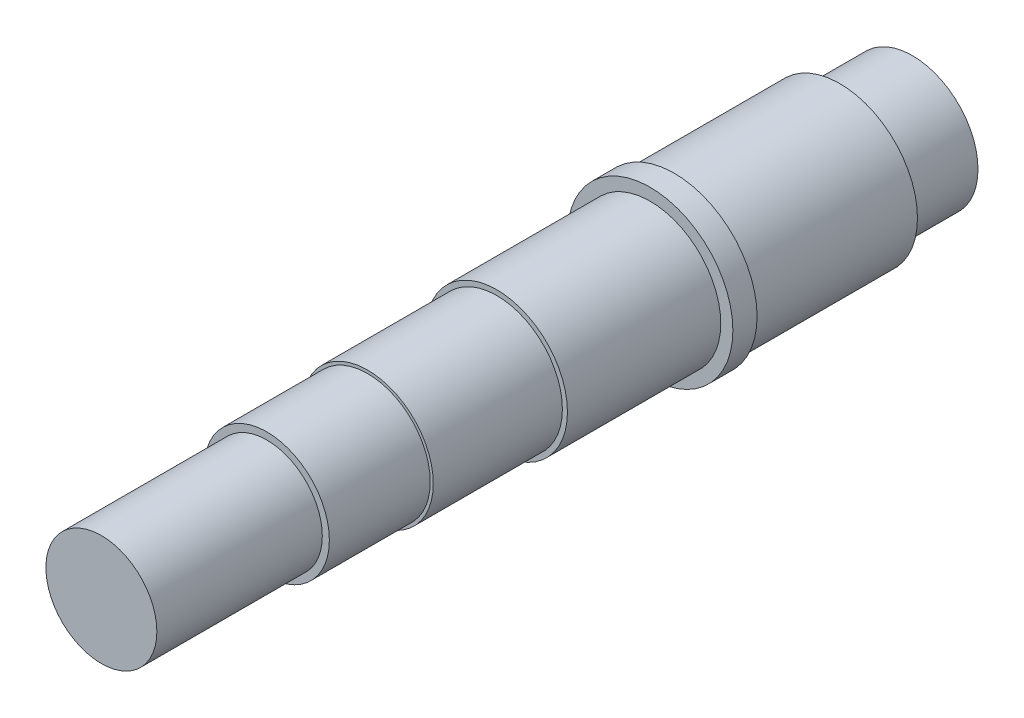
ISO-10303-21;
HEADER;
FILE_DESCRIPTION(('STEP AP214'),'2;1');
FILE_NAME('part.step','',(''),(''),'','','');
FILE_SCHEMA(('AUTOMOTIVE_DESIGN { 1 0 10303 214 1 1 1 1 }'));
ENDSEC;
DATA;
#1=APPLICATION_CONTEXT('core data for automotive mechanical design processes');
#2=APPLICATION_PROTOCOL_DEFINITION('international standard','automotive_design',2000,#1);
#3=PRODUCT_CONTEXT('',#1,'mechanical');
#4=PRODUCT('Part','Part','',(#3));
#5=PRODUCT_RELATED_PRODUCT_CATEGORY('part','',(#4));
#6=PRODUCT_DEFINITION_FORMATION('','',#4);
#7=PRODUCT_DEFINITION_CONTEXT('part definition',#1,'design');
#8=PRODUCT_DEFINITION('design','',#6,#7);
#9=PRODUCT_DEFINITION_SHAPE('','',#8);
#10=(LENGTH_UNIT() NAMED_UNIT(*) SI_UNIT(.MILLI.,.METRE.));
#11=(NAMED_UNIT(*) PLANE_ANGLE_UNIT() SI_UNIT($,.RADIAN.));
#12=(NAMED_UNIT(*) SI_UNIT($,.STERADIAN.) SOLID_ANGLE_UNIT());
#13=UNCERTAINTY_MEASURE_WITH_UNIT(LENGTH_MEASURE(1.E-05),#10,'distance_accuracy_value','');
#14=(GEOMETRIC_REPRESENTATION_CONTEXT(3) GLOBAL_UNCERTAINTY_ASSIGNED_CONTEXT((#13)) GLOBAL_UNIT_ASSIGNED_CONTEXT((#10,
#11,#12)) REPRESENTATION_CONTEXT('',''));
#15=CARTESIAN_POINT('',(0.,0.,0.));
#16=DIRECTION('',(0.,0.,1.));
#17=DIRECTION('',(1.,0.,0.));
#18=AXIS2_PLACEMENT_3D('',#15,#16,#17);
#19=CARTESIAN_POINT('',(0.,0.,320.));
#20=DIRECTION('',(0.,0.,1.));
#21=DIRECTION('',(1.,0.,0.));
#22=AXIS2_PLACEMENT_3D('',#19,#20,#21);
#23=PLANE('',#22);
#24=CARTESIAN_POINT('',(0.,0.,320.));
#25=DIRECTION('',(0.,0.,1.));
#26=DIRECTION('',(1.,0.,0.));
#27=AXIS2_PLACEMENT_3D('',#24,#25,#26);
#28=CIRCLE('',#27,31.);
#29=CARTESIAN_POINT('',(31.,0.,320.));
#30=VERTEX_POINT('',#29);
#31=EDGE_CURVE('E67',#30,#30,#28,.T.);
#32=ORIENTED_EDGE('',*,*,#31,.T.);
#33=EDGE_LOOP('',(#32));
#34=FACE_BOUND('',#33,.T.);
#35=CARTESIAN_POINT('',(0.,0.,320.));
#36=DIRECTION('',(0.,0.,1.));
#37=DIRECTION('',(1.,0.,0.));
#38=AXIS2_PLACEMENT_3D('',#35,#36,#37);
#39=CIRCLE('',#38,27.5);
#40=CARTESIAN_POINT('',(27.5,0.,320.));
#41=VERTEX_POINT('',#40);
#42=EDGE_CURVE('E76',#41,#41,#39,.T.);
#43=ORIENTED_EDGE('',*,*,#42,.F.);
#44=EDGE_LOOP('',(#43));
#45=FACE_BOUND('',#44,.T.);
#46=ADVANCED_FACE('F33',(#34,#45),#23,.T.);
#47=CARTESIAN_POINT('',(0.,0.,270.));
#48=DIRECTION('',(0.,0.,1.));
#49=DIRECTION('',(1.,0.,0.));
#50=AXIS2_PLACEMENT_3D('',#47,#48,#49);
#51=PLANE('',#50);
#52=CARTESIAN_POINT('',(0.,0.,270.));
#53=DIRECTION('',(0.,0.,1.));
#54=DIRECTION('',(1.,0.,0.));
#55=AXIS2_PLACEMENT_3D('',#52,#53,#54);
#56=CIRCLE('',#55,32.5);
#57=CARTESIAN_POINT('',(32.5,0.,270.));
#58=VERTEX_POINT('',#57);
#59=EDGE_CURVE('E61',#58,#58,#56,.T.);
#60=ORIENTED_EDGE('',*,*,#59,.T.);
#61=EDGE_LOOP('',(#60));
#62=FACE_BOUND('',#61,.T.);
#63=CARTESIAN_POINT('',(0.,0.,270.));
#64=DIRECTION('',(0.,0.,1.));
#65=DIRECTION('',(1.,0.,0.));
#66=AXIS2_PLACEMENT_3D('',#63,#64,#65);
#67=CIRCLE('',#66,31.);
#68=CARTESIAN_POINT('',(31.,0.,270.));
#69=VERTEX_POINT('',#68);
#70=EDGE_CURVE('E70',#69,#69,#67,.T.);
#71=ORIENTED_EDGE('',*,*,#70,.F.);
#72=EDGE_LOOP('',(#71));
#73=FACE_BOUND('',#72,.T.);
#74=ADVANCED_FACE('F92',(#62,#73),#51,.T.);
#75=CARTESIAN_POINT('',(0.,0.,206.));
#76=DIRECTION('',(0.,0.,1.));
#77=DIRECTION('',(1.,0.,0.));
#78=AXIS2_PLACEMENT_3D('',#75,#76,#77);
#79=PLANE('',#78);
#80=CARTESIAN_POINT('',(0.,0.,206.));
#81=DIRECTION('',(0.,0.,1.));
#82=DIRECTION('',(1.,0.,0.));
#83=AXIS2_PLACEMENT_3D('',#80,#81,#82);
#84=CIRCLE('',#83,35.);
#85=CARTESIAN_POINT('',(35.,0.,206.));
#86=VERTEX_POINT('',#85);
#87=EDGE_CURVE('E55',#86,#86,#84,.T.);
#88=ORIENTED_EDGE('',*,*,#87,.T.);
#89=EDGE_LOOP('',(#88));
#90=FACE_BOUND('',#89,.T.);
#91=CARTESIAN_POINT('',(0.,0.,206.));
#92=DIRECTION('',(0.,0.,1.));
#93=DIRECTION('',(1.,0.,0.));
#94=AXIS2_PLACEMENT_3D('',#91,#92,#93);
#95=CIRCLE('',#94,32.5);
#96=CARTESIAN_POINT('',(32.5,0.,206.));
#97=VERTEX_POINT('',#96);
#98=EDGE_CURVE('E64',#97,#97,#95,.T.);
#99=ORIENTED_EDGE('',*,*,#98,.F.);
#100=EDGE_LOOP('',(#99));
#101=FACE_BOUND('',#100,.T.);
#102=ADVANCED_FACE('F98',(#90,#101),#79,.T.);
#103=CARTESIAN_POINT('',(0.,0.,130.));
#104=DIRECTION('',(0.,0.,1.));
#105=DIRECTION('',(1.,0.,0.));
#106=AXIS2_PLACEMENT_3D('',#103,#104,#105);
#107=PLANE('',#106);
#108=CARTESIAN_POINT('',(0.,0.,130.));
#109=DIRECTION('',(0.,0.,1.));
#110=DIRECTION('',(1.,0.,0.));
#111=AXIS2_PLACEMENT_3D('',#108,#109,#110);
#112=CIRCLE('',#111,41.);
#113=CARTESIAN_POINT('',(41.,0.,130.));
#114=VERTEX_POINT('',#113);
#115=EDGE_CURVE('E49',#114,#114,#112,.T.);
#116=ORIENTED_EDGE('',*,*,#115,.T.);
#117=EDGE_LOOP('',(#116));
#118=FACE_BOUND('',#117,.T.);
#119=CARTESIAN_POINT('',(0.,0.,130.));
#120=DIRECTION('',(0.,0.,1.));
#121=DIRECTION('',(1.,0.,0.));
#122=AXIS2_PLACEMENT_3D('',#119,#120,#121);
#123=CIRCLE('',#122,35.);
#124=CARTESIAN_POINT('',(35.,0.,130.));
#125=VERTEX_POINT('',#124);
#126=EDGE_CURVE('E58',#125,#125,#123,.T.);
#127=ORIENTED_EDGE('',*,*,#126,.F.);
#128=EDGE_LOOP('',(#127));
#129=FACE_BOUND('',#128,.T.);
#130=ADVANCED_FACE('F113',(#118,#129),#107,.T.);
#131=CARTESIAN_POINT('',(0.,0.,36.));
#132=DIRECTION('',(0.,0.,-1.));
#133=DIRECTION('',(-1.,0.,0.));
#134=AXIS2_PLACEMENT_3D('',#131,#132,#133);
#135=CYLINDRICAL_SURFACE('',#134,32.5);
#136=CARTESIAN_POINT('',(0.,0.,36.));
#137=DIRECTION('',(0.,0.,1.));
#138=DIRECTION('',(1.,0.,0.));
#139=AXIS2_PLACEMENT_3D('',#136,#137,#138);
#140=CIRCLE('',#139,32.5);
#141=CARTESIAN_POINT('',(32.5,0.,36.));
#142=VERTEX_POINT('',#141);
#143=EDGE_CURVE('E10',#142,#142,#140,.T.);
#144=ORIENTED_EDGE('',*,*,#143,.F.);
#145=EDGE_LOOP('',(#144));
#146=FACE_BOUND('',#145,.T.);
#147=CARTESIAN_POINT('',(0.,0.,0.));
#148=DIRECTION('',(0.,0.,1.));
#149=DIRECTION('',(1.,0.,0.));
#150=AXIS2_PLACEMENT_3D('',#147,#148,#149);
#151=CIRCLE('',#150,32.5);
#152=CARTESIAN_POINT('',(32.5,0.,0.));
#153=VERTEX_POINT('',#152);
#154=EDGE_CURVE('E37',#153,#153,#151,.T.);
#155=ORIENTED_EDGE('',*,*,#154,.T.);
#156=EDGE_LOOP('',(#155));
#157=FACE_BOUND('',#156,.T.);
#158=ADVANCED_FACE('F35',(#146,#157),#135,.T.);
#159=CARTESIAN_POINT('',(0.,0.,0.));
#160=DIRECTION('',(0.,0.,1.));
#161=DIRECTION('',(1.,0.,0.));
#162=AXIS2_PLACEMENT_3D('',#159,#160,#161);
#163=PLANE('',#162);
#164=ORIENTED_EDGE('',*,*,#154,.F.);
#165=EDGE_LOOP('',(#164));
#166=FACE_BOUND('',#165,.T.);
#167=ADVANCED_FACE('F133',(#166),#163,.F.);
#168=CARTESIAN_POINT('',(0.,0.,36.));
#169=DIRECTION('',(0.,0.,1.));
#170=DIRECTION('',(1.,0.,0.));
#171=AXIS2_PLACEMENT_3D('',#168,#169,#170);
#172=PLANE('',#171);
#173=CARTESIAN_POINT('',(0.,0.,36.));
#174=DIRECTION('',(0.,0.,1.));
#175=DIRECTION('',(1.,0.,0.));
#176=AXIS2_PLACEMENT_3D('',#173,#174,#175);
#177=CIRCLE('',#176,38.5);
#178=CARTESIAN_POINT('',(38.5,0.,36.));
#179=VERTEX_POINT('',#178);
#180=EDGE_CURVE('E46',#179,#179,#177,.T.);
#181=ORIENTED_EDGE('',*,*,#180,.F.);
#182=EDGE_LOOP('',(#181));
#183=FACE_BOUND('',#182,.T.);
#184=ORIENTED_EDGE('',*,*,#143,.T.);
#185=EDGE_LOOP('',(#184));
#186=FACE_BOUND('',#185,.T.);
#187=ADVANCED_FACE('F130',(#183,#186),#172,.F.);
#188=CARTESIAN_POINT('',(0.,0.,118.));
#189=DIRECTION('',(0.,0.,-1.));
#190=DIRECTION('',(-1.,0.,0.));
#191=AXIS2_PLACEMENT_3D('',#188,#189,#190);
#192=CYLINDRICAL_SURFACE('',#191,38.5);
#193=CARTESIAN_POINT('',(0.,0.,118.));
#194=DIRECTION('',(0.,0.,1.));
#195=DIRECTION('',(1.,0.,0.));
#196=AXIS2_PLACEMENT_3D('',#193,#194,#195);
#197=CIRCLE('',#196,38.5);
#198=CARTESIAN_POINT('',(38.5,0.,118.));
#199=VERTEX_POINT('',#198);
#200=EDGE_CURVE('E44',#199,#199,#197,.T.);
#201=ORIENTED_EDGE('',*,*,#200,.F.);
#202=EDGE_LOOP('',(#201));
#203=FACE_BOUND('',#202,.T.);
#204=ORIENTED_EDGE('',*,*,#180,.T.);
#205=EDGE_LOOP('',(#204));
#206=FACE_BOUND('',#205,.T.);
#207=ADVANCED_FACE('F125',(#203,#206),#192,.T.);
#208=CARTESIAN_POINT('',(0.,0.,118.));
#209=DIRECTION('',(0.,0.,1.));
#210=DIRECTION('',(1.,0.,0.));
#211=AXIS2_PLACEMENT_3D('',#208,#209,#210);
#212=PLANE('',#211);
#213=CARTESIAN_POINT('',(0.,0.,118.));
#214=DIRECTION('',(0.,0.,1.));
#215=DIRECTION('',(1.,0.,0.));
#216=AXIS2_PLACEMENT_3D('',#213,#214,#215);
#217=CIRCLE('',#216,41.);
#218=CARTESIAN_POINT('',(41.,0.,118.));
#219=VERTEX_POINT('',#218);
#220=EDGE_CURVE('E52',#219,#219,#217,.T.);
#221=ORIENTED_EDGE('',*,*,#220,.F.);
#222=EDGE_LOOP('',(#221));
#223=FACE_BOUND('',#222,.T.);
#224=ORIENTED_EDGE('',*,*,#200,.T.);
#225=EDGE_LOOP('',(#224));
#226=FACE_BOUND('',#225,.T.);
#227=ADVANCED_FACE('F122',(#223,#226),#212,.F.);
#228=CARTESIAN_POINT('',(0.,0.,130.));
#229=DIRECTION('',(0.,0.,-1.));
#230=DIRECTION('',(-1.,0.,0.));
#231=AXIS2_PLACEMENT_3D('',#228,#229,#230);
#232=CYLINDRICAL_SURFACE('',#231,41.);
#233=ORIENTED_EDGE('',*,*,#115,.F.);
#234=EDGE_LOOP('',(#233));
#235=FACE_BOUND('',#234,.T.);
#236=ORIENTED_EDGE('',*,*,#220,.T.);
#237=EDGE_LOOP('',(#236));
#238=FACE_BOUND('',#237,.T.);
#239=ADVANCED_FACE('F117',(#235,#238),#232,.T.);
#240=CARTESIAN_POINT('',(0.,0.,206.));
#241=DIRECTION('',(0.,0.,-1.));
#242=DIRECTION('',(-1.,0.,0.));
#243=AXIS2_PLACEMENT_3D('',#240,#241,#242);
#244=CYLINDRICAL_SURFACE('',#243,35.);
#245=ORIENTED_EDGE('',*,*,#87,.F.);
#246=EDGE_LOOP('',(#245));
#247=FACE_BOUND('',#246,.T.);
#248=ORIENTED_EDGE('',*,*,#126,.T.);
#249=EDGE_LOOP('',(#248));
#250=FACE_BOUND('',#249,.T.);
#251=ADVANCED_FACE('F109',(#247,#250),#244,.T.);
#252=CARTESIAN_POINT('',(0.,0.,270.));
#253=DIRECTION('',(0.,0.,-1.));
#254=DIRECTION('',(-1.,0.,0.));
#255=AXIS2_PLACEMENT_3D('',#252,#253,#254);
#256=CYLINDRICAL_SURFACE('',#255,32.5);
#257=ORIENTED_EDGE('',*,*,#59,.F.);
#258=EDGE_LOOP('',(#257));
#259=FACE_BOUND('',#258,.T.);
#260=ORIENTED_EDGE('',*,*,#98,.T.);
#261=EDGE_LOOP('',(#260));
#262=FACE_BOUND('',#261,.T.);
#263=ADVANCED_FACE('F104',(#259,#262),#256,.T.);
#264=CARTESIAN_POINT('',(0.,0.,320.));
#265=DIRECTION('',(0.,0.,-1.));
#266=DIRECTION('',(-1.,0.,0.));
#267=AXIS2_PLACEMENT_3D('',#264,#265,#266);
#268=CYLINDRICAL_SURFACE('',#267,31.);
#269=ORIENTED_EDGE('',*,*,#31,.F.);
#270=EDGE_LOOP('',(#269));
#271=FACE_BOUND('',#270,.T.);
#272=ORIENTED_EDGE('',*,*,#70,.T.);
#273=EDGE_LOOP('',(#272));
#274=FACE_BOUND('',#273,.T.);
#275=ADVANCED_FACE('F87',(#271,#274),#268,.T.);
#276=CARTESIAN_POINT('',(0.,0.,402.));
#277=DIRECTION('',(0.,0.,-1.));
#278=DIRECTION('',(-1.,0.,0.));
#279=AXIS2_PLACEMENT_3D('',#276,#277,#278);
#280=CYLINDRICAL_SURFACE('',#279,27.5);
#281=CARTESIAN_POINT('',(0.,0.,402.));
#282=DIRECTION('',(0.,0.,1.));
#283=DIRECTION('',(1.,0.,0.));
#284=AXIS2_PLACEMENT_3D('',#281,#282,#283);
#285=CIRCLE('',#284,27.5);
#286=CARTESIAN_POINT('',(27.5,0.,402.));
#287=VERTEX_POINT('',#286);
#288=EDGE_CURVE('E73',#287,#287,#285,.T.);
#289=ORIENTED_EDGE('',*,*,#288,.F.);
#290=EDGE_LOOP('',(#289));
#291=FACE_BOUND('',#290,.T.);
#292=ORIENTED_EDGE('',*,*,#42,.T.);
#293=EDGE_LOOP('',(#292));
#294=FACE_BOUND('',#293,.T.);
#295=ADVANCED_FACE('F84',(#291,#294),#280,.T.);
#296=CARTESIAN_POINT('',(0.,0.,402.));
#297=DIRECTION('',(0.,0.,1.));
#298=DIRECTION('',(1.,0.,0.));
#299=AXIS2_PLACEMENT_3D('',#296,#297,#298);
#300=PLANE('',#299);
#301=ORIENTED_EDGE('',*,*,#288,.T.);
#302=EDGE_LOOP('',(#301));
#303=FACE_BOUND('',#302,.T.);
#304=ADVANCED_FACE('F82',(#303),#300,.T.);
#305=CLOSED_SHELL('',(#46,#74,#102,#130,#158,#167,#187,#207,#227,#239,#251,#263,#275,#295,#304));
#306=MANIFOLD_SOLID_BREP('B2',#305);
#307=ADVANCED_BREP_SHAPE_REPRESENTATION('',(#18,#306),#14);
#308=SHAPE_DEFINITION_REPRESENTATION(#9,#307);
ENDSEC;
END-ISO-10303-21;
